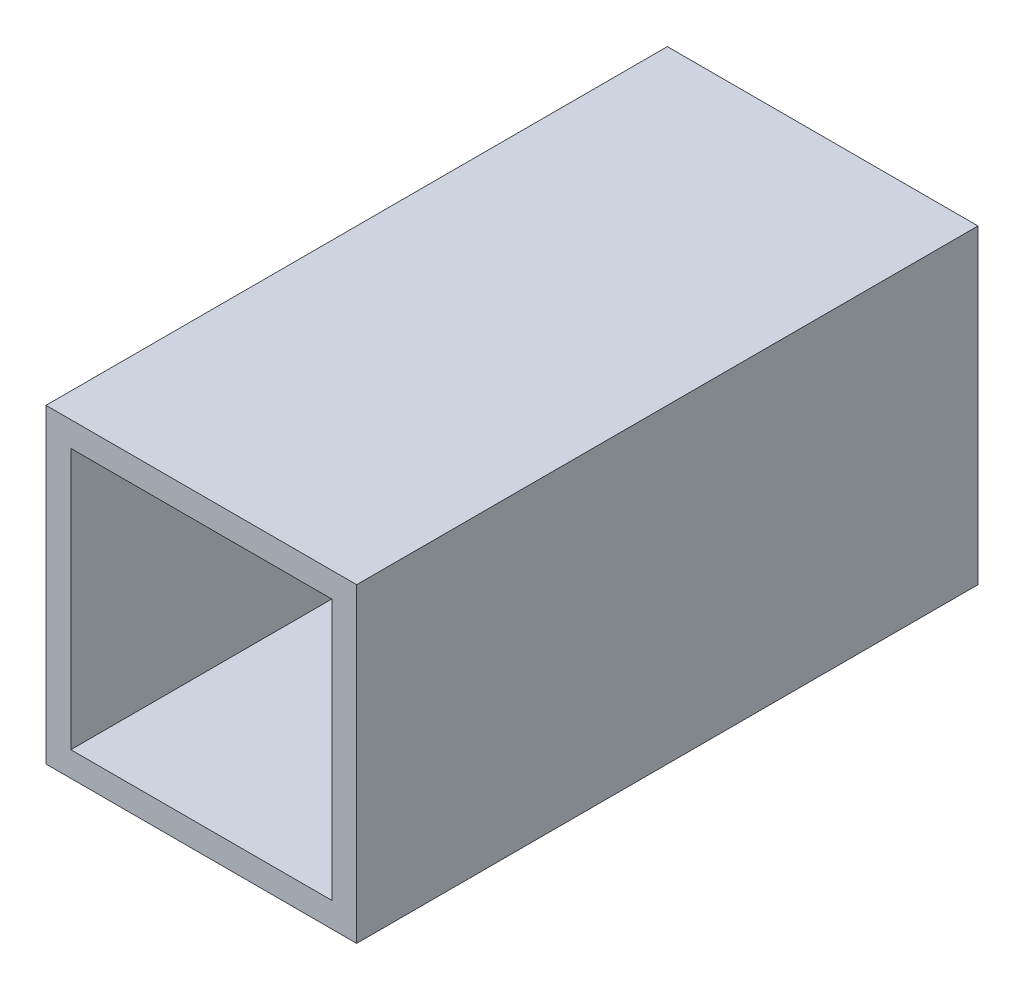
ISO-10303-21;
HEADER;
FILE_DESCRIPTION(('STEP AP214'),'2;1');
FILE_NAME('part.step','',(''),(''),'','','');
FILE_SCHEMA(('AUTOMOTIVE_DESIGN { 1 0 10303 214 1 1 1 1 }'));
ENDSEC;
DATA;
#1=APPLICATION_CONTEXT('core data for automotive mechanical design processes');
#2=APPLICATION_PROTOCOL_DEFINITION('international standard','automotive_design',2000,#1);
#3=PRODUCT_CONTEXT('',#1,'mechanical');
#4=PRODUCT('Part','Part','',(#3));
#5=PRODUCT_RELATED_PRODUCT_CATEGORY('part','',(#4));
#6=PRODUCT_DEFINITION_FORMATION('','',#4);
#7=PRODUCT_DEFINITION_CONTEXT('part definition',#1,'design');
#8=PRODUCT_DEFINITION('design','',#6,#7);
#9=PRODUCT_DEFINITION_SHAPE('','',#8);
#10=(LENGTH_UNIT() NAMED_UNIT(*) SI_UNIT(.MILLI.,.METRE.));
#11=(NAMED_UNIT(*) PLANE_ANGLE_UNIT() SI_UNIT($,.RADIAN.));
#12=(NAMED_UNIT(*) SI_UNIT($,.STERADIAN.) SOLID_ANGLE_UNIT());
#13=UNCERTAINTY_MEASURE_WITH_UNIT(LENGTH_MEASURE(1.E-05),#10,'distance_accuracy_value','');
#14=(GEOMETRIC_REPRESENTATION_CONTEXT(3) GLOBAL_UNCERTAINTY_ASSIGNED_CONTEXT((#13)) GLOBAL_UNIT_ASSIGNED_CONTEXT((#10,
#11,#12)) REPRESENTATION_CONTEXT('',''));
#15=CARTESIAN_POINT('',(0.,0.,0.));
#16=DIRECTION('',(0.,0.,1.));
#17=DIRECTION('',(1.,0.,0.));
#18=AXIS2_PLACEMENT_3D('',#15,#16,#17);
#19=CARTESIAN_POINT('',(-42.1189873417722,-45.2537974683544,50.8));
#20=DIRECTION('',(-1.,0.,0.));
#21=DIRECTION('',(0.,0.,1.));
#22=AXIS2_PLACEMENT_3D('',#19,#20,#21);
#23=PLANE('',#22);
#24=DIRECTION('',(0.,1.,0.));
#25=VECTOR('',#24,1.);
#26=CARTESIAN_POINT('',(-42.1189873417722,-45.2537974683544,0.));
#27=LINE('',#26,#25);
#28=CARTESIAN_POINT('',(-42.1189873417722,-45.2537974683544,0.));
#29=VERTEX_POINT('',#28);
#30=CARTESIAN_POINT('',(-42.1189873417722,-19.8537974683544,0.));
#31=VERTEX_POINT('',#30);
#32=EDGE_CURVE('E130',#29,#31,#27,.T.);
#33=ORIENTED_EDGE('',*,*,#32,.T.);
#34=DIRECTION('',(0.,0.,-1.));
#35=VECTOR('',#34,1.);
#36=CARTESIAN_POINT('',(-42.1189873417722,-19.8537974683544,50.8));
#37=LINE('',#36,#35);
#38=CARTESIAN_POINT('',(-42.1189873417722,-19.8537974683544,50.8));
#39=VERTEX_POINT('',#38);
#40=EDGE_CURVE('E11',#39,#31,#37,.T.);
#41=ORIENTED_EDGE('',*,*,#40,.F.);
#42=DIRECTION('',(0.,1.,0.));
#43=VECTOR('',#42,1.);
#44=CARTESIAN_POINT('',(-42.1189873417722,-45.2537974683544,50.8));
#45=LINE('',#44,#43);
#46=CARTESIAN_POINT('',(-42.1189873417722,-45.2537974683544,50.8));
#47=VERTEX_POINT('',#46);
#48=EDGE_CURVE('E134',#47,#39,#45,.T.);
#49=ORIENTED_EDGE('',*,*,#48,.F.);
#50=DIRECTION('',(0.,0.,-1.));
#51=VECTOR('',#50,1.);
#52=CARTESIAN_POINT('',(-42.1189873417722,-45.2537974683544,50.8));
#53=LINE('',#52,#51);
#54=EDGE_CURVE('E144',#47,#29,#53,.T.);
#55=ORIENTED_EDGE('',*,*,#54,.T.);
#56=EDGE_LOOP('',(#33,#41,#49,#55));
#57=FACE_BOUND('',#56,.T.);
#58=ADVANCED_FACE('F33',(#57),#23,.F.);
#59=CARTESIAN_POINT('',(-67.5189873417722,-19.8537974683544,50.8));
#60=DIRECTION('',(0.,-1.,0.));
#61=DIRECTION('',(0.,0.,-1.));
#62=AXIS2_PLACEMENT_3D('',#59,#60,#61);
#63=PLANE('',#62);
#64=DIRECTION('',(-1.,0.,0.));
#65=VECTOR('',#64,1.);
#66=CARTESIAN_POINT('',(-67.5189873417722,-19.8537974683544,0.));
#67=LINE('',#66,#65);
#68=CARTESIAN_POINT('',(-67.5189873417722,-19.8537974683544,0.));
#69=VERTEX_POINT('',#68);
#70=EDGE_CURVE('E147',#31,#69,#67,.T.);
#71=ORIENTED_EDGE('',*,*,#70,.T.);
#72=DIRECTION('',(0.,0.,-1.));
#73=VECTOR('',#72,1.);
#74=CARTESIAN_POINT('',(-67.5189873417722,-19.8537974683544,50.8));
#75=LINE('',#74,#73);
#76=CARTESIAN_POINT('',(-67.5189873417722,-19.8537974683544,50.8));
#77=VERTEX_POINT('',#76);
#78=EDGE_CURVE('E40',#77,#69,#75,.T.);
#79=ORIENTED_EDGE('',*,*,#78,.F.);
#80=DIRECTION('',(-1.,0.,0.));
#81=VECTOR('',#80,1.);
#82=CARTESIAN_POINT('',(-67.5189873417722,-19.8537974683544,50.8));
#83=LINE('',#82,#81);
#84=EDGE_CURVE('E137',#39,#77,#83,.T.);
#85=ORIENTED_EDGE('',*,*,#84,.F.);
#86=ORIENTED_EDGE('',*,*,#40,.T.);
#87=EDGE_LOOP('',(#71,#79,#85,#86));
#88=FACE_BOUND('',#87,.T.);
#89=ADVANCED_FACE('F175',(#88),#63,.F.);
#90=CARTESIAN_POINT('',(-67.5189873417722,-45.2537974683544,50.8));
#91=DIRECTION('',(1.,0.,0.));
#92=DIRECTION('',(0.,0.,-1.));
#93=AXIS2_PLACEMENT_3D('',#90,#91,#92);
#94=PLANE('',#93);
#95=DIRECTION('',(0.,-1.,0.));
#96=VECTOR('',#95,1.);
#97=CARTESIAN_POINT('',(-67.5189873417722,-45.2537974683544,0.));
#98=LINE('',#97,#96);
#99=CARTESIAN_POINT('',(-67.5189873417722,-45.2537974683544,0.));
#100=VERTEX_POINT('',#99);
#101=EDGE_CURVE('E149',#69,#100,#98,.T.);
#102=ORIENTED_EDGE('',*,*,#101,.T.);
#103=DIRECTION('',(0.,0.,-1.));
#104=VECTOR('',#103,1.);
#105=CARTESIAN_POINT('',(-67.5189873417722,-45.2537974683544,50.8));
#106=LINE('',#105,#104);
#107=CARTESIAN_POINT('',(-67.5189873417722,-45.2537974683544,50.8));
#108=VERTEX_POINT('',#107);
#109=EDGE_CURVE('E154',#108,#100,#106,.T.);
#110=ORIENTED_EDGE('',*,*,#109,.F.);
#111=DIRECTION('',(0.,-1.,0.));
#112=VECTOR('',#111,1.);
#113=CARTESIAN_POINT('',(-67.5189873417722,-45.2537974683544,50.8));
#114=LINE('',#113,#112);
#115=EDGE_CURVE('E140',#77,#108,#114,.T.);
#116=ORIENTED_EDGE('',*,*,#115,.F.);
#117=ORIENTED_EDGE('',*,*,#78,.T.);
#118=EDGE_LOOP('',(#102,#110,#116,#117));
#119=FACE_BOUND('',#118,.T.);
#120=ADVANCED_FACE('F161',(#119),#94,.F.);
#121=CARTESIAN_POINT('',(-67.5189873417722,-45.2537974683544,50.8));
#122=DIRECTION('',(0.,1.,0.));
#123=DIRECTION('',(0.,0.,1.));
#124=AXIS2_PLACEMENT_3D('',#121,#122,#123);
#125=PLANE('',#124);
#126=DIRECTION('',(1.,0.,0.));
#127=VECTOR('',#126,1.);
#128=CARTESIAN_POINT('',(-67.5189873417722,-45.2537974683544,0.));
#129=LINE('',#128,#127);
#130=EDGE_CURVE('E138',#100,#29,#129,.T.);
#131=ORIENTED_EDGE('',*,*,#130,.T.);
#132=ORIENTED_EDGE('',*,*,#54,.F.);
#133=DIRECTION('',(1.,0.,0.));
#134=VECTOR('',#133,1.);
#135=CARTESIAN_POINT('',(-67.5189873417722,-45.2537974683544,50.8));
#136=LINE('',#135,#134);
#137=EDGE_CURVE('E142',#108,#47,#136,.T.);
#138=ORIENTED_EDGE('',*,*,#137,.F.);
#139=ORIENTED_EDGE('',*,*,#109,.T.);
#140=EDGE_LOOP('',(#131,#132,#138,#139));
#141=FACE_BOUND('',#140,.T.);
#142=ADVANCED_FACE('F168',(#141),#125,.F.);
#143=CARTESIAN_POINT('',(0.,0.,50.8));
#144=DIRECTION('',(0.,0.,-1.));
#145=DIRECTION('',(-1.,0.,0.));
#146=AXIS2_PLACEMENT_3D('',#143,#144,#145);
#147=PLANE('',#146);
#148=DIRECTION('',(-1.,0.,0.));
#149=VECTOR('',#148,1.);
#150=CARTESIAN_POINT('',(-65.4869873417721,-21.8857974683544,50.8));
#151=LINE('',#150,#149);
#152=CARTESIAN_POINT('',(-44.1509873417722,-21.8857974683544,50.8));
#153=VERTEX_POINT('',#152);
#154=CARTESIAN_POINT('',(-65.4869873417721,-21.8857974683544,50.8));
#155=VERTEX_POINT('',#154);
#156=EDGE_CURVE('E124',#153,#155,#151,.T.);
#157=ORIENTED_EDGE('',*,*,#156,.F.);
#158=DIRECTION('',(0.,1.,0.));
#159=VECTOR('',#158,1.);
#160=CARTESIAN_POINT('',(-44.1509873417722,-21.8857974683544,50.8));
#161=LINE('',#160,#159);
#162=CARTESIAN_POINT('',(-44.1509873417722,-43.2217974683544,50.8));
#163=VERTEX_POINT('',#162);
#164=EDGE_CURVE('E47',#163,#153,#161,.T.);
#165=ORIENTED_EDGE('',*,*,#164,.F.);
#166=DIRECTION('',(1.,0.,0.));
#167=VECTOR('',#166,1.);
#168=CARTESIAN_POINT('',(-65.4869873417721,-43.2217974683544,50.8));
#169=LINE('',#168,#167);
#170=CARTESIAN_POINT('',(-65.4869873417721,-43.2217974683544,50.8));
#171=VERTEX_POINT('',#170);
#172=EDGE_CURVE('E115',#171,#163,#169,.T.);
#173=ORIENTED_EDGE('',*,*,#172,.F.);
#174=DIRECTION('',(0.,-1.,0.));
#175=VECTOR('',#174,1.);
#176=CARTESIAN_POINT('',(-65.4869873417721,-21.8857974683544,50.8));
#177=LINE('',#176,#175);
#178=EDGE_CURVE('E118',#155,#171,#177,.T.);
#179=ORIENTED_EDGE('',*,*,#178,.F.);
#180=EDGE_LOOP('',(#157,#165,#173,#179));
#181=FACE_BOUND('',#180,.T.);
#182=ORIENTED_EDGE('',*,*,#48,.T.);
#183=ORIENTED_EDGE('',*,*,#84,.T.);
#184=ORIENTED_EDGE('',*,*,#115,.T.);
#185=ORIENTED_EDGE('',*,*,#137,.T.);
#186=EDGE_LOOP('',(#182,#183,#184,#185));
#187=FACE_BOUND('',#186,.T.);
#188=ADVANCED_FACE('F174',(#181,#187),#147,.F.);
#189=CARTESIAN_POINT('',(0.,0.,0.));
#190=DIRECTION('',(0.,0.,-1.));
#191=DIRECTION('',(-1.,0.,0.));
#192=AXIS2_PLACEMENT_3D('',#189,#190,#191);
#193=PLANE('',#192);
#194=DIRECTION('',(0.,1.,0.));
#195=VECTOR('',#194,1.);
#196=CARTESIAN_POINT('',(-44.1509873417722,-21.8857974683544,0.));
#197=LINE('',#196,#195);
#198=CARTESIAN_POINT('',(-44.1509873417722,-43.2217974683544,0.));
#199=VERTEX_POINT('',#198);
#200=CARTESIAN_POINT('',(-44.1509873417722,-21.8857974683544,0.));
#201=VERTEX_POINT('',#200);
#202=EDGE_CURVE('E99',#199,#201,#197,.T.);
#203=ORIENTED_EDGE('',*,*,#202,.T.);
#204=DIRECTION('',(-1.,0.,0.));
#205=VECTOR('',#204,1.);
#206=CARTESIAN_POINT('',(-65.4869873417721,-21.8857974683544,0.));
#207=LINE('',#206,#205);
#208=CARTESIAN_POINT('',(-65.4869873417721,-21.8857974683544,0.));
#209=VERTEX_POINT('',#208);
#210=EDGE_CURVE('E108',#201,#209,#207,.T.);
#211=ORIENTED_EDGE('',*,*,#210,.T.);
#212=DIRECTION('',(0.,-1.,0.));
#213=VECTOR('',#212,1.);
#214=CARTESIAN_POINT('',(-65.4869873417721,-21.8857974683544,0.));
#215=LINE('',#214,#213);
#216=CARTESIAN_POINT('',(-65.4869873417721,-43.2217974683544,0.));
#217=VERTEX_POINT('',#216);
#218=EDGE_CURVE('E55',#209,#217,#215,.T.);
#219=ORIENTED_EDGE('',*,*,#218,.T.);
#220=DIRECTION('',(1.,0.,0.));
#221=VECTOR('',#220,1.);
#222=CARTESIAN_POINT('',(-65.4869873417721,-43.2217974683544,0.));
#223=LINE('',#222,#221);
#224=EDGE_CURVE('E105',#217,#199,#223,.T.);
#225=ORIENTED_EDGE('',*,*,#224,.T.);
#226=EDGE_LOOP('',(#203,#211,#219,#225));
#227=FACE_BOUND('',#226,.T.);
#228=ORIENTED_EDGE('',*,*,#32,.F.);
#229=ORIENTED_EDGE('',*,*,#130,.F.);
#230=ORIENTED_EDGE('',*,*,#101,.F.);
#231=ORIENTED_EDGE('',*,*,#70,.F.);
#232=EDGE_LOOP('',(#228,#229,#230,#231));
#233=FACE_BOUND('',#232,.T.);
#234=ADVANCED_FACE('F112',(#227,#233),#193,.T.);
#235=CARTESIAN_POINT('',(-44.1509873417722,-21.8857974683544,0.));
#236=DIRECTION('',(1.,0.,0.));
#237=DIRECTION('',(0.,0.,-1.));
#238=AXIS2_PLACEMENT_3D('',#235,#236,#237);
#239=PLANE('',#238);
#240=ORIENTED_EDGE('',*,*,#164,.T.);
#241=DIRECTION('',(0.,0.,1.));
#242=VECTOR('',#241,1.);
#243=CARTESIAN_POINT('',(-44.1509873417722,-21.8857974683544,0.));
#244=LINE('',#243,#242);
#245=EDGE_CURVE('E95',#201,#153,#244,.T.);
#246=ORIENTED_EDGE('',*,*,#245,.F.);
#247=ORIENTED_EDGE('',*,*,#202,.F.);
#248=DIRECTION('',(0.,0.,1.));
#249=VECTOR('',#248,1.);
#250=CARTESIAN_POINT('',(-44.1509873417722,-43.2217974683544,0.));
#251=LINE('',#250,#249);
#252=EDGE_CURVE('E128',#199,#163,#251,.T.);
#253=ORIENTED_EDGE('',*,*,#252,.T.);
#254=EDGE_LOOP('',(#240,#246,#247,#253));
#255=FACE_BOUND('',#254,.T.);
#256=ADVANCED_FACE('F97',(#255),#239,.F.);
#257=CARTESIAN_POINT('',(-65.4869873417721,-43.2217974683544,0.));
#258=DIRECTION('',(0.,-1.,0.));
#259=DIRECTION('',(0.,0.,-1.));
#260=AXIS2_PLACEMENT_3D('',#257,#258,#259);
#261=PLANE('',#260);
#262=ORIENTED_EDGE('',*,*,#172,.T.);
#263=ORIENTED_EDGE('',*,*,#252,.F.);
#264=ORIENTED_EDGE('',*,*,#224,.F.);
#265=DIRECTION('',(0.,0.,1.));
#266=VECTOR('',#265,1.);
#267=CARTESIAN_POINT('',(-65.4869873417721,-43.2217974683544,0.));
#268=LINE('',#267,#266);
#269=EDGE_CURVE('E131',#217,#171,#268,.T.);
#270=ORIENTED_EDGE('',*,*,#269,.T.);
#271=EDGE_LOOP('',(#262,#263,#264,#270));
#272=FACE_BOUND('',#271,.T.);
#273=ADVANCED_FACE('F192',(#272),#261,.F.);
#274=CARTESIAN_POINT('',(-65.4869873417721,-21.8857974683544,0.));
#275=DIRECTION('',(-1.,0.,0.));
#276=DIRECTION('',(0.,0.,1.));
#277=AXIS2_PLACEMENT_3D('',#274,#275,#276);
#278=PLANE('',#277);
#279=ORIENTED_EDGE('',*,*,#178,.T.);
#280=ORIENTED_EDGE('',*,*,#269,.F.);
#281=ORIENTED_EDGE('',*,*,#218,.F.);
#282=DIRECTION('',(0.,0.,1.));
#283=VECTOR('',#282,1.);
#284=CARTESIAN_POINT('',(-65.4869873417721,-21.8857974683544,0.));
#285=LINE('',#284,#283);
#286=EDGE_CURVE('E104',#209,#155,#285,.T.);
#287=ORIENTED_EDGE('',*,*,#286,.T.);
#288=EDGE_LOOP('',(#279,#280,#281,#287));
#289=FACE_BOUND('',#288,.T.);
#290=ADVANCED_FACE('F195',(#289),#278,.F.);
#291=CARTESIAN_POINT('',(-65.4869873417721,-21.8857974683544,0.));
#292=DIRECTION('',(0.,1.,0.));
#293=DIRECTION('',(0.,0.,1.));
#294=AXIS2_PLACEMENT_3D('',#291,#292,#293);
#295=PLANE('',#294);
#296=ORIENTED_EDGE('',*,*,#156,.T.);
#297=ORIENTED_EDGE('',*,*,#286,.F.);
#298=ORIENTED_EDGE('',*,*,#210,.F.);
#299=ORIENTED_EDGE('',*,*,#245,.T.);
#300=EDGE_LOOP('',(#296,#297,#298,#299));
#301=FACE_BOUND('',#300,.T.);
#302=ADVANCED_FACE('F109',(#301),#295,.F.);
#303=CLOSED_SHELL('',(#58,#89,#120,#142,#188,#234,#256,#273,#290,#302));
#304=MANIFOLD_SOLID_BREP('B2',#303);
#305=ADVANCED_BREP_SHAPE_REPRESENTATION('',(#18,#304),#14);
#306=SHAPE_DEFINITION_REPRESENTATION(#9,#305);
ENDSEC;
END-ISO-10303-21;
